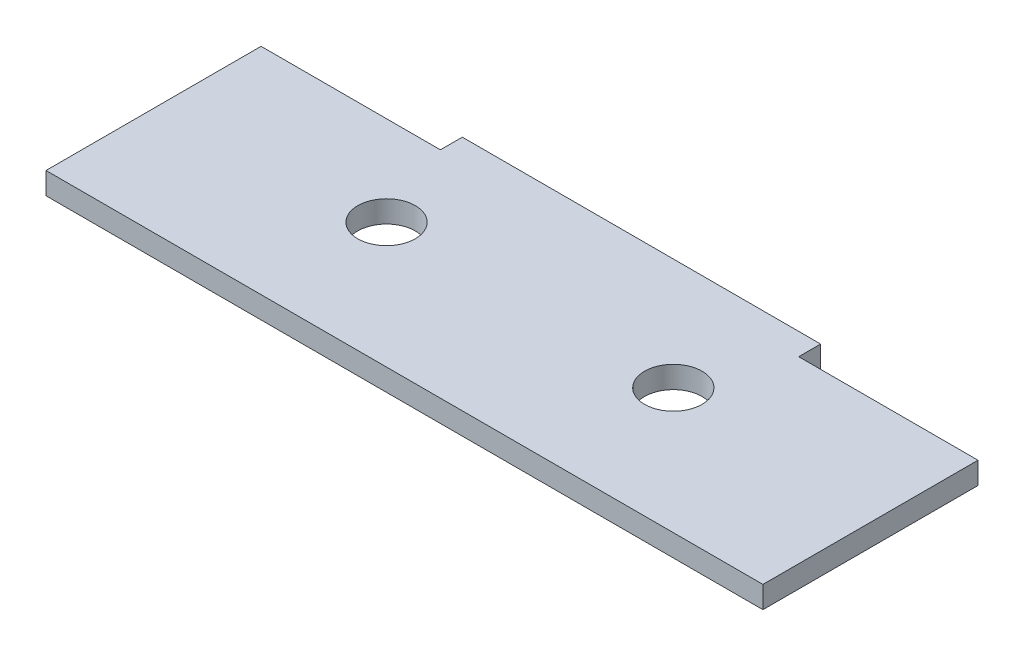
ISO-10303-21;
HEADER;
FILE_DESCRIPTION(('STEP AP214'),'2;1');
FILE_NAME('part.step','',(''),(''),'','','');
FILE_SCHEMA(('AUTOMOTIVE_DESIGN { 1 0 10303 214 1 1 1 1 }'));
ENDSEC;
DATA;
#1=APPLICATION_CONTEXT('core data for automotive mechanical design processes');
#2=APPLICATION_PROTOCOL_DEFINITION('international standard','automotive_design',2000,#1);
#3=PRODUCT_CONTEXT('',#1,'mechanical');
#4=PRODUCT('Part','Part','',(#3));
#5=PRODUCT_RELATED_PRODUCT_CATEGORY('part','',(#4));
#6=PRODUCT_DEFINITION_FORMATION('','',#4);
#7=PRODUCT_DEFINITION_CONTEXT('part definition',#1,'design');
#8=PRODUCT_DEFINITION('design','',#6,#7);
#9=PRODUCT_DEFINITION_SHAPE('','',#8);
#10=(LENGTH_UNIT() NAMED_UNIT(*) SI_UNIT(.MILLI.,.METRE.));
#11=(NAMED_UNIT(*) PLANE_ANGLE_UNIT() SI_UNIT($,.RADIAN.));
#12=(NAMED_UNIT(*) SI_UNIT($,.STERADIAN.) SOLID_ANGLE_UNIT());
#13=UNCERTAINTY_MEASURE_WITH_UNIT(LENGTH_MEASURE(1.E-05),#10,'distance_accuracy_value','');
#14=(GEOMETRIC_REPRESENTATION_CONTEXT(3) GLOBAL_UNCERTAINTY_ASSIGNED_CONTEXT((#13)) GLOBAL_UNIT_ASSIGNED_CONTEXT((#10,
#11,#12)) REPRESENTATION_CONTEXT('',''));
#15=CARTESIAN_POINT('',(0.,0.,0.));
#16=DIRECTION('',(0.,0.,1.));
#17=DIRECTION('',(1.,0.,0.));
#18=AXIS2_PLACEMENT_3D('',#15,#16,#17);
#19=CARTESIAN_POINT('',(24.99,-351.87,-32.1299999999999));
#20=DIRECTION('',(0.,0.,1.));
#21=DIRECTION('',(1.,0.,0.));
#22=AXIS2_PLACEMENT_3D('',#19,#20,#21);
#23=PLANE('',#22);
#24=DIRECTION('',(1.,0.,0.));
#25=VECTOR('',#24,1.);
#26=CARTESIAN_POINT('',(24.99,-348.81,-32.1299999999999));
#27=LINE('',#26,#25);
#28=CARTESIAN_POINT('',(-24.99,-348.81,-32.1299999999999));
#29=VERTEX_POINT('',#28);
#30=CARTESIAN_POINT('',(24.99,-348.81,-32.1299999999999));
#31=VERTEX_POINT('',#30);
#32=EDGE_CURVE('E139',#29,#31,#27,.T.);
#33=ORIENTED_EDGE('',*,*,#32,.T.);
#34=DIRECTION('',(0.,1.,0.));
#35=VECTOR('',#34,1.);
#36=CARTESIAN_POINT('',(24.99,-351.87,-32.1299999999999));
#37=LINE('',#36,#35);
#38=CARTESIAN_POINT('',(24.99,-351.87,-32.1299999999999));
#39=VERTEX_POINT('',#38);
#40=EDGE_CURVE('E11',#39,#31,#37,.T.);
#41=ORIENTED_EDGE('',*,*,#40,.F.);
#42=DIRECTION('',(1.,0.,0.));
#43=VECTOR('',#42,1.);
#44=CARTESIAN_POINT('',(24.99,-351.87,-32.1299999999999));
#45=LINE('',#44,#43);
#46=CARTESIAN_POINT('',(-24.99,-351.87,-32.1299999999999));
#47=VERTEX_POINT('',#46);
#48=EDGE_CURVE('E154',#47,#39,#45,.T.);
#49=ORIENTED_EDGE('',*,*,#48,.F.);
#50=DIRECTION('',(0.,1.,0.));
#51=VECTOR('',#50,1.);
#52=CARTESIAN_POINT('',(-24.99,-351.87,-32.1299999999999));
#53=LINE('',#52,#51);
#54=EDGE_CURVE('E135',#47,#29,#53,.T.);
#55=ORIENTED_EDGE('',*,*,#54,.T.);
#56=EDGE_LOOP('',(#33,#41,#49,#55));
#57=FACE_BOUND('',#56,.T.);
#58=ADVANCED_FACE('F43',(#57),#23,.F.);
#59=CARTESIAN_POINT('',(24.99,-351.87,-29.0699999999999));
#60=DIRECTION('',(-1.,0.,0.));
#61=DIRECTION('',(0.,0.,1.));
#62=AXIS2_PLACEMENT_3D('',#59,#60,#61);
#63=PLANE('',#62);
#64=DIRECTION('',(0.,0.,1.));
#65=VECTOR('',#64,1.);
#66=CARTESIAN_POINT('',(24.99,-348.81,-29.0699999999999));
#67=LINE('',#66,#65);
#68=CARTESIAN_POINT('',(24.99,-348.81,-29.0699999999999));
#69=VERTEX_POINT('',#68);
#70=EDGE_CURVE('E142',#31,#69,#67,.T.);
#71=ORIENTED_EDGE('',*,*,#70,.T.);
#72=DIRECTION('',(0.,1.,0.));
#73=VECTOR('',#72,1.);
#74=CARTESIAN_POINT('',(24.99,-351.87,-29.0699999999999));
#75=LINE('',#74,#73);
#76=CARTESIAN_POINT('',(24.99,-351.87,-29.0699999999999));
#77=VERTEX_POINT('',#76);
#78=EDGE_CURVE('E51',#77,#69,#75,.T.);
#79=ORIENTED_EDGE('',*,*,#78,.F.);
#80=DIRECTION('',(0.,0.,1.));
#81=VECTOR('',#80,1.);
#82=CARTESIAN_POINT('',(24.99,-351.87,-29.0699999999999));
#83=LINE('',#82,#81);
#84=EDGE_CURVE('E102',#39,#77,#83,.T.);
#85=ORIENTED_EDGE('',*,*,#84,.F.);
#86=ORIENTED_EDGE('',*,*,#40,.T.);
#87=EDGE_LOOP('',(#71,#79,#85,#86));
#88=FACE_BOUND('',#87,.T.);
#89=ADVANCED_FACE('F223',(#88),#63,.F.);
#90=CARTESIAN_POINT('',(50.,-351.87,-29.07));
#91=DIRECTION('',(0.,0.,1.));
#92=DIRECTION('',(1.,0.,0.));
#93=AXIS2_PLACEMENT_3D('',#90,#91,#92);
#94=PLANE('',#93);
#95=DIRECTION('',(1.,0.,0.));
#96=VECTOR('',#95,1.);
#97=CARTESIAN_POINT('',(50.,-348.81,-29.07));
#98=LINE('',#97,#96);
#99=CARTESIAN_POINT('',(50.,-348.81,-29.07));
#100=VERTEX_POINT('',#99);
#101=EDGE_CURVE('E145',#69,#100,#98,.T.);
#102=ORIENTED_EDGE('',*,*,#101,.T.);
#103=DIRECTION('',(0.,1.,0.));
#104=VECTOR('',#103,1.);
#105=CARTESIAN_POINT('',(50.,-351.87,-29.07));
#106=LINE('',#105,#104);
#107=CARTESIAN_POINT('',(50.,-351.87,-29.07));
#108=VERTEX_POINT('',#107);
#109=EDGE_CURVE('E161',#108,#100,#106,.T.);
#110=ORIENTED_EDGE('',*,*,#109,.F.);
#111=DIRECTION('',(1.,0.,0.));
#112=VECTOR('',#111,1.);
#113=CARTESIAN_POINT('',(50.,-351.87,-29.07));
#114=LINE('',#113,#112);
#115=EDGE_CURVE('E169',#77,#108,#114,.T.);
#116=ORIENTED_EDGE('',*,*,#115,.F.);
#117=ORIENTED_EDGE('',*,*,#78,.T.);
#118=EDGE_LOOP('',(#102,#110,#116,#117));
#119=FACE_BOUND('',#118,.T.);
#120=ADVANCED_FACE('F167',(#119),#94,.F.);
#121=CARTESIAN_POINT('',(50.,-351.87,0.929999999999993));
#122=DIRECTION('',(-1.,0.,0.));
#123=DIRECTION('',(0.,0.,1.));
#124=AXIS2_PLACEMENT_3D('',#121,#122,#123);
#125=PLANE('',#124);
#126=DIRECTION('',(0.,0.,1.));
#127=VECTOR('',#126,1.);
#128=CARTESIAN_POINT('',(50.,-348.81,0.929999999999993));
#129=LINE('',#128,#127);
#130=CARTESIAN_POINT('',(50.,-348.81,0.929999999999993));
#131=VERTEX_POINT('',#130);
#132=EDGE_CURVE('E147',#100,#131,#129,.T.);
#133=ORIENTED_EDGE('',*,*,#132,.T.);
#134=DIRECTION('',(0.,1.,0.));
#135=VECTOR('',#134,1.);
#136=CARTESIAN_POINT('',(50.,-351.87,0.929999999999993));
#137=LINE('',#136,#135);
#138=CARTESIAN_POINT('',(50.,-351.87,0.929999999999993));
#139=VERTEX_POINT('',#138);
#140=EDGE_CURVE('E158',#139,#131,#137,.T.);
#141=ORIENTED_EDGE('',*,*,#140,.F.);
#142=DIRECTION('',(0.,0.,1.));
#143=VECTOR('',#142,1.);
#144=CARTESIAN_POINT('',(50.,-351.87,0.929999999999993));
#145=LINE('',#144,#143);
#146=EDGE_CURVE('E181',#108,#139,#145,.T.);
#147=ORIENTED_EDGE('',*,*,#146,.F.);
#148=ORIENTED_EDGE('',*,*,#109,.T.);
#149=EDGE_LOOP('',(#133,#141,#147,#148));
#150=FACE_BOUND('',#149,.T.);
#151=ADVANCED_FACE('F177',(#150),#125,.F.);
#152=CARTESIAN_POINT('',(-50.,-351.87,0.929999999999993));
#153=DIRECTION('',(0.,0.,-1.));
#154=DIRECTION('',(-1.,0.,0.));
#155=AXIS2_PLACEMENT_3D('',#152,#153,#154);
#156=PLANE('',#155);
#157=DIRECTION('',(-1.,0.,0.));
#158=VECTOR('',#157,1.);
#159=CARTESIAN_POINT('',(-50.,-348.81,0.929999999999993));
#160=LINE('',#159,#158);
#161=CARTESIAN_POINT('',(-50.,-348.81,0.929999999999993));
#162=VERTEX_POINT('',#161);
#163=EDGE_CURVE('E149',#131,#162,#160,.T.);
#164=ORIENTED_EDGE('',*,*,#163,.T.);
#165=DIRECTION('',(0.,1.,0.));
#166=VECTOR('',#165,1.);
#167=CARTESIAN_POINT('',(-50.,-351.87,0.929999999999993));
#168=LINE('',#167,#166);
#169=CARTESIAN_POINT('',(-50.,-351.87,0.929999999999993));
#170=VERTEX_POINT('',#169);
#171=EDGE_CURVE('E130',#170,#162,#168,.T.);
#172=ORIENTED_EDGE('',*,*,#171,.F.);
#173=DIRECTION('',(-1.,0.,0.));
#174=VECTOR('',#173,1.);
#175=CARTESIAN_POINT('',(-50.,-351.87,0.929999999999993));
#176=LINE('',#175,#174);
#177=EDGE_CURVE('E121',#139,#170,#176,.T.);
#178=ORIENTED_EDGE('',*,*,#177,.F.);
#179=ORIENTED_EDGE('',*,*,#140,.T.);
#180=EDGE_LOOP('',(#164,#172,#178,#179));
#181=FACE_BOUND('',#180,.T.);
#182=ADVANCED_FACE('F180',(#181),#156,.F.);
#183=CARTESIAN_POINT('',(-50.,-351.87,-29.07));
#184=DIRECTION('',(1.,0.,0.));
#185=DIRECTION('',(0.,0.,-1.));
#186=AXIS2_PLACEMENT_3D('',#183,#184,#185);
#187=PLANE('',#186);
#188=DIRECTION('',(0.,0.,-1.));
#189=VECTOR('',#188,1.);
#190=CARTESIAN_POINT('',(-50.,-348.81,-29.07));
#191=LINE('',#190,#189);
#192=CARTESIAN_POINT('',(-50.,-348.81,-29.07));
#193=VERTEX_POINT('',#192);
#194=EDGE_CURVE('E129',#162,#193,#191,.T.);
#195=ORIENTED_EDGE('',*,*,#194,.T.);
#196=DIRECTION('',(0.,1.,0.));
#197=VECTOR('',#196,1.);
#198=CARTESIAN_POINT('',(-50.,-351.87,-29.07));
#199=LINE('',#198,#197);
#200=CARTESIAN_POINT('',(-50.,-351.87,-29.07));
#201=VERTEX_POINT('',#200);
#202=EDGE_CURVE('E126',#201,#193,#199,.T.);
#203=ORIENTED_EDGE('',*,*,#202,.F.);
#204=DIRECTION('',(0.,0.,-1.));
#205=VECTOR('',#204,1.);
#206=CARTESIAN_POINT('',(-50.,-351.87,-29.07));
#207=LINE('',#206,#205);
#208=EDGE_CURVE('E115',#170,#201,#207,.T.);
#209=ORIENTED_EDGE('',*,*,#208,.F.);
#210=ORIENTED_EDGE('',*,*,#171,.T.);
#211=EDGE_LOOP('',(#195,#203,#209,#210));
#212=FACE_BOUND('',#211,.T.);
#213=ADVANCED_FACE('F127',(#212),#187,.F.);
#214=CARTESIAN_POINT('',(-24.99,-351.87,-29.07));
#215=DIRECTION('',(0.,0.,1.));
#216=DIRECTION('',(1.,0.,0.));
#217=AXIS2_PLACEMENT_3D('',#214,#215,#216);
#218=PLANE('',#217);
#219=DIRECTION('',(1.,0.,0.));
#220=VECTOR('',#219,1.);
#221=CARTESIAN_POINT('',(-24.99,-348.81,-29.07));
#222=LINE('',#221,#220);
#223=CARTESIAN_POINT('',(-24.99,-348.81,-29.07));
#224=VERTEX_POINT('',#223);
#225=EDGE_CURVE('E88',#193,#224,#222,.T.);
#226=ORIENTED_EDGE('',*,*,#225,.T.);
#227=DIRECTION('',(0.,1.,0.));
#228=VECTOR('',#227,1.);
#229=CARTESIAN_POINT('',(-24.99,-351.87,-29.07));
#230=LINE('',#229,#228);
#231=CARTESIAN_POINT('',(-24.99,-351.87,-29.07));
#232=VERTEX_POINT('',#231);
#233=EDGE_CURVE('E131',#232,#224,#230,.T.);
#234=ORIENTED_EDGE('',*,*,#233,.F.);
#235=DIRECTION('',(1.,0.,0.));
#236=VECTOR('',#235,1.);
#237=CARTESIAN_POINT('',(-24.99,-351.87,-29.07));
#238=LINE('',#237,#236);
#239=EDGE_CURVE('E119',#201,#232,#238,.T.);
#240=ORIENTED_EDGE('',*,*,#239,.F.);
#241=ORIENTED_EDGE('',*,*,#202,.T.);
#242=EDGE_LOOP('',(#226,#234,#240,#241));
#243=FACE_BOUND('',#242,.T.);
#244=ADVANCED_FACE('F133',(#243),#218,.F.);
#245=CARTESIAN_POINT('',(-24.99,-351.87,-32.1299999999999));
#246=DIRECTION('',(1.,0.,0.));
#247=DIRECTION('',(0.,0.,-1.));
#248=AXIS2_PLACEMENT_3D('',#245,#246,#247);
#249=PLANE('',#248);
#250=DIRECTION('',(0.,0.,-1.));
#251=VECTOR('',#250,1.);
#252=CARTESIAN_POINT('',(-24.99,-348.81,-32.1299999999999));
#253=LINE('',#252,#251);
#254=EDGE_CURVE('E94',#224,#29,#253,.T.);
#255=ORIENTED_EDGE('',*,*,#254,.T.);
#256=ORIENTED_EDGE('',*,*,#54,.F.);
#257=DIRECTION('',(0.,0.,-1.));
#258=VECTOR('',#257,1.);
#259=CARTESIAN_POINT('',(-24.99,-351.87,-32.1299999999999));
#260=LINE('',#259,#258);
#261=EDGE_CURVE('E59',#232,#47,#260,.T.);
#262=ORIENTED_EDGE('',*,*,#261,.F.);
#263=ORIENTED_EDGE('',*,*,#233,.T.);
#264=EDGE_LOOP('',(#255,#256,#262,#263));
#265=FACE_BOUND('',#264,.T.);
#266=ADVANCED_FACE('F214',(#265),#249,.F.);
#267=CARTESIAN_POINT('',(0.,-351.87,0.));
#268=DIRECTION('',(0.,1.,0.));
#269=DIRECTION('',(0.,0.,1.));
#270=AXIS2_PLACEMENT_3D('',#267,#268,#269);
#271=PLANE('',#270);
#272=CARTESIAN_POINT('',(20.,-351.87,-16.57));
#273=DIRECTION('',(0.,1.,0.));
#274=DIRECTION('',(0.,0.,1.));
#275=AXIS2_PLACEMENT_3D('',#272,#273,#274);
#276=CIRCLE('',#275,4.01);
#277=CARTESIAN_POINT('',(20.,-351.87,-12.56));
#278=VERTEX_POINT('',#277);
#279=EDGE_CURVE('E143',#278,#278,#276,.T.);
#280=ORIENTED_EDGE('',*,*,#279,.T.);
#281=EDGE_LOOP('',(#280));
#282=FACE_BOUND('',#281,.T.);
#283=CARTESIAN_POINT('',(-20.,-351.87,-16.57));
#284=DIRECTION('',(0.,1.,0.));
#285=DIRECTION('',(0.,0.,1.));
#286=AXIS2_PLACEMENT_3D('',#283,#284,#285);
#287=CIRCLE('',#286,4.01);
#288=CARTESIAN_POINT('',(-20.,-351.87,-12.56));
#289=VERTEX_POINT('',#288);
#290=EDGE_CURVE('E189',#289,#289,#287,.T.);
#291=ORIENTED_EDGE('',*,*,#290,.T.);
#292=EDGE_LOOP('',(#291));
#293=FACE_BOUND('',#292,.T.);
#294=ORIENTED_EDGE('',*,*,#48,.T.);
#295=ORIENTED_EDGE('',*,*,#84,.T.);
#296=ORIENTED_EDGE('',*,*,#115,.T.);
#297=ORIENTED_EDGE('',*,*,#146,.T.);
#298=ORIENTED_EDGE('',*,*,#177,.T.);
#299=ORIENTED_EDGE('',*,*,#208,.T.);
#300=ORIENTED_EDGE('',*,*,#239,.T.);
#301=ORIENTED_EDGE('',*,*,#261,.T.);
#302=EDGE_LOOP('',(#294,#295,#296,#297,#298,#299,#300,#301));
#303=FACE_BOUND('',#302,.T.);
#304=ADVANCED_FACE('F117',(#282,#293,#303),#271,.F.);
#305=CARTESIAN_POINT('',(0.,-348.81,0.));
#306=DIRECTION('',(0.,1.,0.));
#307=DIRECTION('',(0.,0.,1.));
#308=AXIS2_PLACEMENT_3D('',#305,#306,#307);
#309=PLANE('',#308);
#310=CARTESIAN_POINT('',(20.,-348.81,-16.57));
#311=DIRECTION('',(0.,1.,0.));
#312=DIRECTION('',(0.,0.,1.));
#313=AXIS2_PLACEMENT_3D('',#310,#311,#312);
#314=CIRCLE('',#313,4.01);
#315=CARTESIAN_POINT('',(20.,-348.81,-12.56));
#316=VERTEX_POINT('',#315);
#317=EDGE_CURVE('E192',#316,#316,#314,.T.);
#318=ORIENTED_EDGE('',*,*,#317,.F.);
#319=EDGE_LOOP('',(#318));
#320=FACE_BOUND('',#319,.T.);
#321=CARTESIAN_POINT('',(-20.,-348.81,-16.57));
#322=DIRECTION('',(0.,1.,0.));
#323=DIRECTION('',(0.,0.,1.));
#324=AXIS2_PLACEMENT_3D('',#321,#322,#323);
#325=CIRCLE('',#324,4.01);
#326=CARTESIAN_POINT('',(-20.,-348.81,-12.56));
#327=VERTEX_POINT('',#326);
#328=EDGE_CURVE('E193',#327,#327,#325,.T.);
#329=ORIENTED_EDGE('',*,*,#328,.F.);
#330=EDGE_LOOP('',(#329));
#331=FACE_BOUND('',#330,.T.);
#332=ORIENTED_EDGE('',*,*,#32,.F.);
#333=ORIENTED_EDGE('',*,*,#254,.F.);
#334=ORIENTED_EDGE('',*,*,#225,.F.);
#335=ORIENTED_EDGE('',*,*,#194,.F.);
#336=ORIENTED_EDGE('',*,*,#163,.F.);
#337=ORIENTED_EDGE('',*,*,#132,.F.);
#338=ORIENTED_EDGE('',*,*,#101,.F.);
#339=ORIENTED_EDGE('',*,*,#70,.F.);
#340=EDGE_LOOP('',(#332,#333,#334,#335,#336,#337,#338,#339));
#341=FACE_BOUND('',#340,.T.);
#342=ADVANCED_FACE('F173',(#320,#331,#341),#309,.T.);
#343=CARTESIAN_POINT('',(-20.,-424.98,-16.57));
#344=DIRECTION('',(0.,1.,0.));
#345=DIRECTION('',(0.,0.,1.));
#346=AXIS2_PLACEMENT_3D('',#343,#344,#345);
#347=CYLINDRICAL_SURFACE('',#346,4.01);
#348=ORIENTED_EDGE('',*,*,#328,.T.);
#349=EDGE_LOOP('',(#348));
#350=FACE_BOUND('',#349,.T.);
#351=ORIENTED_EDGE('',*,*,#290,.F.);
#352=EDGE_LOOP('',(#351));
#353=FACE_BOUND('',#352,.T.);
#354=ADVANCED_FACE('F204',(#350,#353),#347,.F.);
#355=CARTESIAN_POINT('',(20.,-424.98,-16.57));
#356=DIRECTION('',(0.,1.,0.));
#357=DIRECTION('',(0.,0.,1.));
#358=AXIS2_PLACEMENT_3D('',#355,#356,#357);
#359=CYLINDRICAL_SURFACE('',#358,4.01);
#360=ORIENTED_EDGE('',*,*,#317,.T.);
#361=EDGE_LOOP('',(#360));
#362=FACE_BOUND('',#361,.T.);
#363=ORIENTED_EDGE('',*,*,#279,.F.);
#364=EDGE_LOOP('',(#363));
#365=FACE_BOUND('',#364,.T.);
#366=ADVANCED_FACE('F199',(#362,#365),#359,.F.);
#367=CLOSED_SHELL('',(#58,#89,#120,#151,#182,#213,#244,#266,#304,#342,#354,#366));
#368=MANIFOLD_SOLID_BREP('B2',#367);
#369=ADVANCED_BREP_SHAPE_REPRESENTATION('',(#18,#368),#14);
#370=SHAPE_DEFINITION_REPRESENTATION(#9,#369);
ENDSEC;
END-ISO-10303-21;
